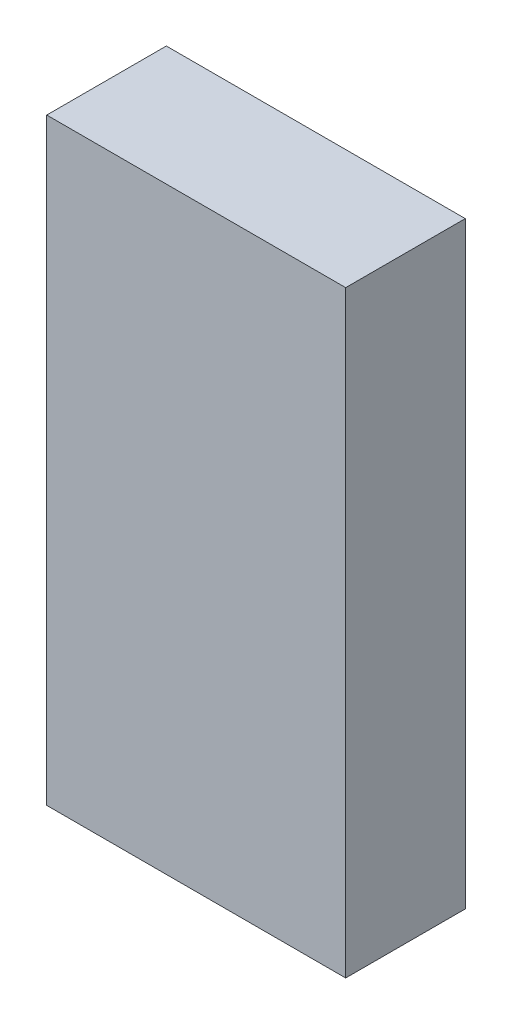
ISO-10303-21;
HEADER;
FILE_DESCRIPTION(('STEP AP214'),'2;1');
FILE_NAME('part.step','',(''),(''),'','','');
FILE_SCHEMA(('AUTOMOTIVE_DESIGN { 1 0 10303 214 1 1 1 1 }'));
ENDSEC;
DATA;
#1=APPLICATION_CONTEXT('core data for automotive mechanical design processes');
#2=APPLICATION_PROTOCOL_DEFINITION('international standard','automotive_design',2000,#1);
#3=PRODUCT_CONTEXT('',#1,'mechanical');
#4=PRODUCT('Part','Part','',(#3));
#5=PRODUCT_RELATED_PRODUCT_CATEGORY('part','',(#4));
#6=PRODUCT_DEFINITION_FORMATION('','',#4);
#7=PRODUCT_DEFINITION_CONTEXT('part definition',#1,'design');
#8=PRODUCT_DEFINITION('design','',#6,#7);
#9=PRODUCT_DEFINITION_SHAPE('','',#8);
#10=(LENGTH_UNIT() NAMED_UNIT(*) SI_UNIT(.MILLI.,.METRE.));
#11=(NAMED_UNIT(*) PLANE_ANGLE_UNIT() SI_UNIT($,.RADIAN.));
#12=(NAMED_UNIT(*) SI_UNIT($,.STERADIAN.) SOLID_ANGLE_UNIT());
#13=UNCERTAINTY_MEASURE_WITH_UNIT(LENGTH_MEASURE(1.E-05),#10,'distance_accuracy_value','');
#14=(GEOMETRIC_REPRESENTATION_CONTEXT(3) GLOBAL_UNCERTAINTY_ASSIGNED_CONTEXT((#13)) GLOBAL_UNIT_ASSIGNED_CONTEXT((#10,
#11,#12)) REPRESENTATION_CONTEXT('',''));
#15=CARTESIAN_POINT('',(0.,0.,0.));
#16=DIRECTION('',(0.,0.,1.));
#17=DIRECTION('',(1.,0.,0.));
#18=AXIS2_PLACEMENT_3D('',#15,#16,#17);
#19=CARTESIAN_POINT('',(0.,0.,4.));
#20=DIRECTION('',(1.,0.,0.));
#21=DIRECTION('',(0.,0.,-1.));
#22=AXIS2_PLACEMENT_3D('',#19,#20,#21);
#23=PLANE('',#22);
#24=DIRECTION('',(0.,-1.,0.));
#25=VECTOR('',#24,1.);
#26=CARTESIAN_POINT('',(0.,0.,0.));
#27=LINE('',#26,#25);
#28=CARTESIAN_POINT('',(0.,20.,0.));
#29=VERTEX_POINT('',#28);
#30=CARTESIAN_POINT('',(0.,0.,0.));
#31=VERTEX_POINT('',#30);
#32=EDGE_CURVE('E98',#29,#31,#27,.T.);
#33=ORIENTED_EDGE('',*,*,#32,.T.);
#34=DIRECTION('',(0.,0.,-1.));
#35=VECTOR('',#34,1.);
#36=CARTESIAN_POINT('',(0.,0.,4.));
#37=LINE('',#36,#35);
#38=CARTESIAN_POINT('',(0.,0.,4.));
#39=VERTEX_POINT('',#38);
#40=EDGE_CURVE('E11',#39,#31,#37,.T.);
#41=ORIENTED_EDGE('',*,*,#40,.F.);
#42=DIRECTION('',(0.,-1.,0.));
#43=VECTOR('',#42,1.);
#44=CARTESIAN_POINT('',(0.,0.,4.));
#45=LINE('',#44,#43);
#46=CARTESIAN_POINT('',(0.,20.,4.));
#47=VERTEX_POINT('',#46);
#48=EDGE_CURVE('E86',#47,#39,#45,.T.);
#49=ORIENTED_EDGE('',*,*,#48,.F.);
#50=DIRECTION('',(0.,0.,-1.));
#51=VECTOR('',#50,1.);
#52=CARTESIAN_POINT('',(0.,20.,4.));
#53=LINE('',#52,#51);
#54=EDGE_CURVE('E94',#47,#29,#53,.T.);
#55=ORIENTED_EDGE('',*,*,#54,.T.);
#56=EDGE_LOOP('',(#33,#41,#49,#55));
#57=FACE_BOUND('',#56,.T.);
#58=ADVANCED_FACE('F35',(#57),#23,.F.);
#59=CARTESIAN_POINT('',(0.,0.,4.));
#60=DIRECTION('',(0.,1.,0.));
#61=DIRECTION('',(0.,0.,1.));
#62=AXIS2_PLACEMENT_3D('',#59,#60,#61);
#63=PLANE('',#62);
#64=DIRECTION('',(1.,0.,0.));
#65=VECTOR('',#64,1.);
#66=CARTESIAN_POINT('',(0.,0.,0.));
#67=LINE('',#66,#65);
#68=CARTESIAN_POINT('',(10.,0.,0.));
#69=VERTEX_POINT('',#68);
#70=EDGE_CURVE('E90',#31,#69,#67,.T.);
#71=ORIENTED_EDGE('',*,*,#70,.T.);
#72=DIRECTION('',(0.,0.,-1.));
#73=VECTOR('',#72,1.);
#74=CARTESIAN_POINT('',(10.,0.,4.));
#75=LINE('',#74,#73);
#76=CARTESIAN_POINT('',(10.,0.,4.));
#77=VERTEX_POINT('',#76);
#78=EDGE_CURVE('E43',#77,#69,#75,.T.);
#79=ORIENTED_EDGE('',*,*,#78,.F.);
#80=DIRECTION('',(1.,0.,0.));
#81=VECTOR('',#80,1.);
#82=CARTESIAN_POINT('',(0.,0.,4.));
#83=LINE('',#82,#81);
#84=EDGE_CURVE('E81',#39,#77,#83,.T.);
#85=ORIENTED_EDGE('',*,*,#84,.F.);
#86=ORIENTED_EDGE('',*,*,#40,.T.);
#87=EDGE_LOOP('',(#71,#79,#85,#86));
#88=FACE_BOUND('',#87,.T.);
#89=ADVANCED_FACE('F89',(#88),#63,.F.);
#90=CARTESIAN_POINT('',(10.,0.,4.));
#91=DIRECTION('',(-1.,0.,0.));
#92=DIRECTION('',(0.,-1.,0.));
#93=AXIS2_PLACEMENT_3D('',#90,#91,#92);
#94=PLANE('',#93);
#95=DIRECTION('',(0.,1.,0.));
#96=VECTOR('',#95,1.);
#97=CARTESIAN_POINT('',(10.,0.,0.));
#98=LINE('',#97,#96);
#99=CARTESIAN_POINT('',(10.,20.,0.));
#100=VERTEX_POINT('',#99);
#101=EDGE_CURVE('E68',#69,#100,#98,.T.);
#102=ORIENTED_EDGE('',*,*,#101,.T.);
#103=DIRECTION('',(0.,0.,-1.));
#104=VECTOR('',#103,1.);
#105=CARTESIAN_POINT('',(10.,20.,4.));
#106=LINE('',#105,#104);
#107=CARTESIAN_POINT('',(10.,20.,4.));
#108=VERTEX_POINT('',#107);
#109=EDGE_CURVE('E91',#108,#100,#106,.T.);
#110=ORIENTED_EDGE('',*,*,#109,.F.);
#111=DIRECTION('',(0.,1.,0.));
#112=VECTOR('',#111,1.);
#113=CARTESIAN_POINT('',(10.,0.,4.));
#114=LINE('',#113,#112);
#115=EDGE_CURVE('E84',#77,#108,#114,.T.);
#116=ORIENTED_EDGE('',*,*,#115,.F.);
#117=ORIENTED_EDGE('',*,*,#78,.T.);
#118=EDGE_LOOP('',(#102,#110,#116,#117));
#119=FACE_BOUND('',#118,.T.);
#120=ADVANCED_FACE('F92',(#119),#94,.F.);
#121=CARTESIAN_POINT('',(0.,20.,4.));
#122=DIRECTION('',(0.,-1.,0.));
#123=DIRECTION('',(0.,0.,-1.));
#124=AXIS2_PLACEMENT_3D('',#121,#122,#123);
#125=PLANE('',#124);
#126=DIRECTION('',(-1.,0.,0.));
#127=VECTOR('',#126,1.);
#128=CARTESIAN_POINT('',(0.,20.,0.));
#129=LINE('',#128,#127);
#130=EDGE_CURVE('E74',#100,#29,#129,.T.);
#131=ORIENTED_EDGE('',*,*,#130,.T.);
#132=ORIENTED_EDGE('',*,*,#54,.F.);
#133=DIRECTION('',(-1.,0.,0.));
#134=VECTOR('',#133,1.);
#135=CARTESIAN_POINT('',(0.,20.,4.));
#136=LINE('',#135,#134);
#137=EDGE_CURVE('E51',#108,#47,#136,.T.);
#138=ORIENTED_EDGE('',*,*,#137,.F.);
#139=ORIENTED_EDGE('',*,*,#109,.T.);
#140=EDGE_LOOP('',(#131,#132,#138,#139));
#141=FACE_BOUND('',#140,.T.);
#142=ADVANCED_FACE('F105',(#141),#125,.F.);
#143=CARTESIAN_POINT('',(0.,0.,4.));
#144=DIRECTION('',(0.,0.,-1.));
#145=DIRECTION('',(-1.,0.,0.));
#146=AXIS2_PLACEMENT_3D('',#143,#144,#145);
#147=PLANE('',#146);
#148=ORIENTED_EDGE('',*,*,#48,.T.);
#149=ORIENTED_EDGE('',*,*,#84,.T.);
#150=ORIENTED_EDGE('',*,*,#115,.T.);
#151=ORIENTED_EDGE('',*,*,#137,.T.);
#152=EDGE_LOOP('',(#148,#149,#150,#151));
#153=FACE_BOUND('',#152,.T.);
#154=ADVANCED_FACE('F82',(#153),#147,.F.);
#155=CARTESIAN_POINT('',(0.,0.,0.));
#156=DIRECTION('',(0.,0.,-1.));
#157=DIRECTION('',(-1.,0.,0.));
#158=AXIS2_PLACEMENT_3D('',#155,#156,#157);
#159=PLANE('',#158);
#160=ORIENTED_EDGE('',*,*,#32,.F.);
#161=ORIENTED_EDGE('',*,*,#130,.F.);
#162=ORIENTED_EDGE('',*,*,#101,.F.);
#163=ORIENTED_EDGE('',*,*,#70,.F.);
#164=EDGE_LOOP('',(#160,#161,#162,#163));
#165=FACE_BOUND('',#164,.T.);
#166=ADVANCED_FACE('F108',(#165),#159,.T.);
#167=CLOSED_SHELL('',(#58,#89,#120,#142,#154,#166));
#168=MANIFOLD_SOLID_BREP('B2',#167);
#169=ADVANCED_BREP_SHAPE_REPRESENTATION('',(#18,#168),#14);
#170=SHAPE_DEFINITION_REPRESENTATION(#9,#169);
ENDSEC;
END-ISO-10303-21;
